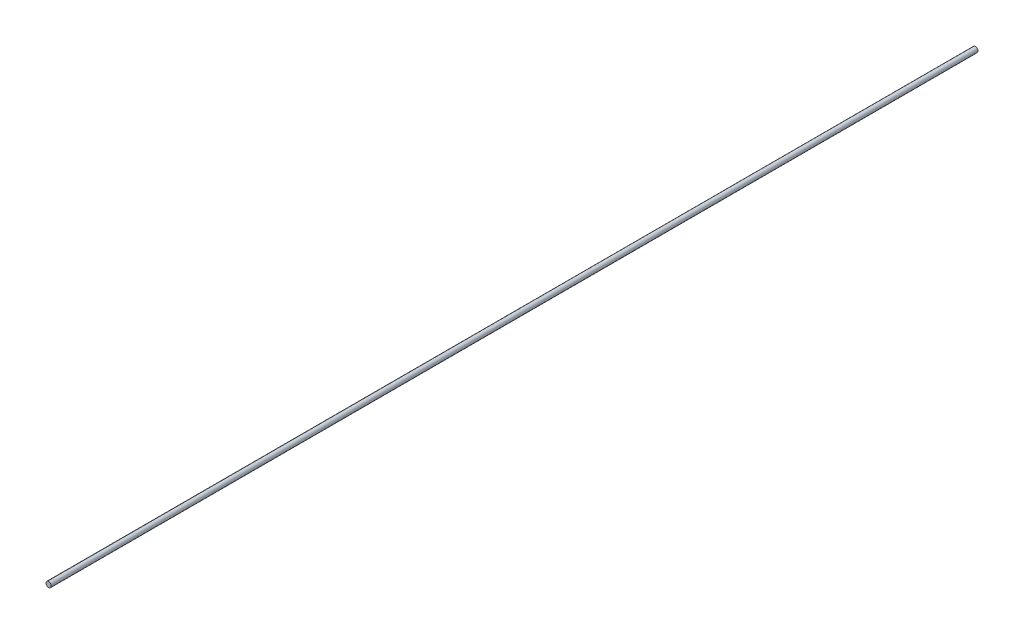
ISO-10303-21;
HEADER;
FILE_DESCRIPTION(('STEP AP214'),'2;1');
FILE_NAME('part.step','',(''),(''),'','','');
FILE_SCHEMA(('AUTOMOTIVE_DESIGN { 1 0 10303 214 1 1 1 1 }'));
ENDSEC;
DATA;
#1=APPLICATION_CONTEXT('core data for automotive mechanical design processes');
#2=APPLICATION_PROTOCOL_DEFINITION('international standard','automotive_design',2000,#1);
#3=PRODUCT_CONTEXT('',#1,'mechanical');
#4=PRODUCT('Part','Part','',(#3));
#5=PRODUCT_RELATED_PRODUCT_CATEGORY('part','',(#4));
#6=PRODUCT_DEFINITION_FORMATION('','',#4);
#7=PRODUCT_DEFINITION_CONTEXT('part definition',#1,'design');
#8=PRODUCT_DEFINITION('design','',#6,#7);
#9=PRODUCT_DEFINITION_SHAPE('','',#8);
#10=(LENGTH_UNIT() NAMED_UNIT(*) SI_UNIT(.MILLI.,.METRE.));
#11=(NAMED_UNIT(*) PLANE_ANGLE_UNIT() SI_UNIT($,.RADIAN.));
#12=(NAMED_UNIT(*) SI_UNIT($,.STERADIAN.) SOLID_ANGLE_UNIT());
#13=UNCERTAINTY_MEASURE_WITH_UNIT(LENGTH_MEASURE(1.E-05),#10,'distance_accuracy_value','');
#14=(GEOMETRIC_REPRESENTATION_CONTEXT(3) GLOBAL_UNCERTAINTY_ASSIGNED_CONTEXT((#13)) GLOBAL_UNIT_ASSIGNED_CONTEXT((#10,
#11,#12)) REPRESENTATION_CONTEXT('',''));
#15=CARTESIAN_POINT('',(0.,0.,0.));
#16=DIRECTION('',(0.,0.,1.));
#17=DIRECTION('',(1.,0.,0.));
#18=AXIS2_PLACEMENT_3D('',#15,#16,#17);
#19=CARTESIAN_POINT('',(0.,0.,4488.434));
#20=DIRECTION('',(0.,0.,-1.));
#21=DIRECTION('',(-1.,0.,0.));
#22=AXIS2_PLACEMENT_3D('',#19,#20,#21);
#23=CYLINDRICAL_SURFACE('',#22,12.7);
#24=CARTESIAN_POINT('',(0.,0.,4488.434));
#25=DIRECTION('',(0.,0.,1.));
#26=DIRECTION('',(1.,0.,0.));
#27=AXIS2_PLACEMENT_3D('',#24,#25,#26);
#28=CIRCLE('',#27,12.7);
#29=CARTESIAN_POINT('',(12.7,0.,4488.434));
#30=VERTEX_POINT('',#29);
#31=EDGE_CURVE('E10',#30,#30,#28,.T.);
#32=ORIENTED_EDGE('',*,*,#31,.F.);
#33=EDGE_LOOP('',(#32));
#34=FACE_BOUND('',#33,.T.);
#35=CARTESIAN_POINT('',(0.,0.,0.));
#36=DIRECTION('',(0.,0.,1.));
#37=DIRECTION('',(1.,0.,0.));
#38=AXIS2_PLACEMENT_3D('',#35,#36,#37);
#39=CIRCLE('',#38,12.7);
#40=CARTESIAN_POINT('',(12.7,0.,0.));
#41=VERTEX_POINT('',#40);
#42=EDGE_CURVE('E44',#41,#41,#39,.T.);
#43=ORIENTED_EDGE('',*,*,#42,.T.);
#44=EDGE_LOOP('',(#43));
#45=FACE_BOUND('',#44,.T.);
#46=ADVANCED_FACE('F45',(#34,#45),#23,.T.);
#47=CARTESIAN_POINT('',(0.,0.,4488.434));
#48=DIRECTION('',(0.,0.,1.));
#49=DIRECTION('',(1.,0.,0.));
#50=AXIS2_PLACEMENT_3D('',#47,#48,#49);
#51=PLANE('',#50);
#52=ORIENTED_EDGE('',*,*,#31,.T.);
#53=EDGE_LOOP('',(#52));
#54=FACE_BOUND('',#53,.T.);
#55=ADVANCED_FACE('F60',(#54),#51,.T.);
#56=CARTESIAN_POINT('',(0.,0.,0.));
#57=DIRECTION('',(0.,0.,1.));
#58=DIRECTION('',(1.,0.,0.));
#59=AXIS2_PLACEMENT_3D('',#56,#57,#58);
#60=PLANE('',#59);
#61=ORIENTED_EDGE('',*,*,#42,.F.);
#62=EDGE_LOOP('',(#61));
#63=FACE_BOUND('',#62,.T.);
#64=ADVANCED_FACE('F54',(#63),#60,.F.);
#65=CLOSED_SHELL('',(#46,#55,#64));
#66=MANIFOLD_SOLID_BREP('B2',#65);
#67=ADVANCED_BREP_SHAPE_REPRESENTATION('',(#18,#66),#14);
#68=SHAPE_DEFINITION_REPRESENTATION(#9,#67);
ENDSEC;
END-ISO-10303-21;
